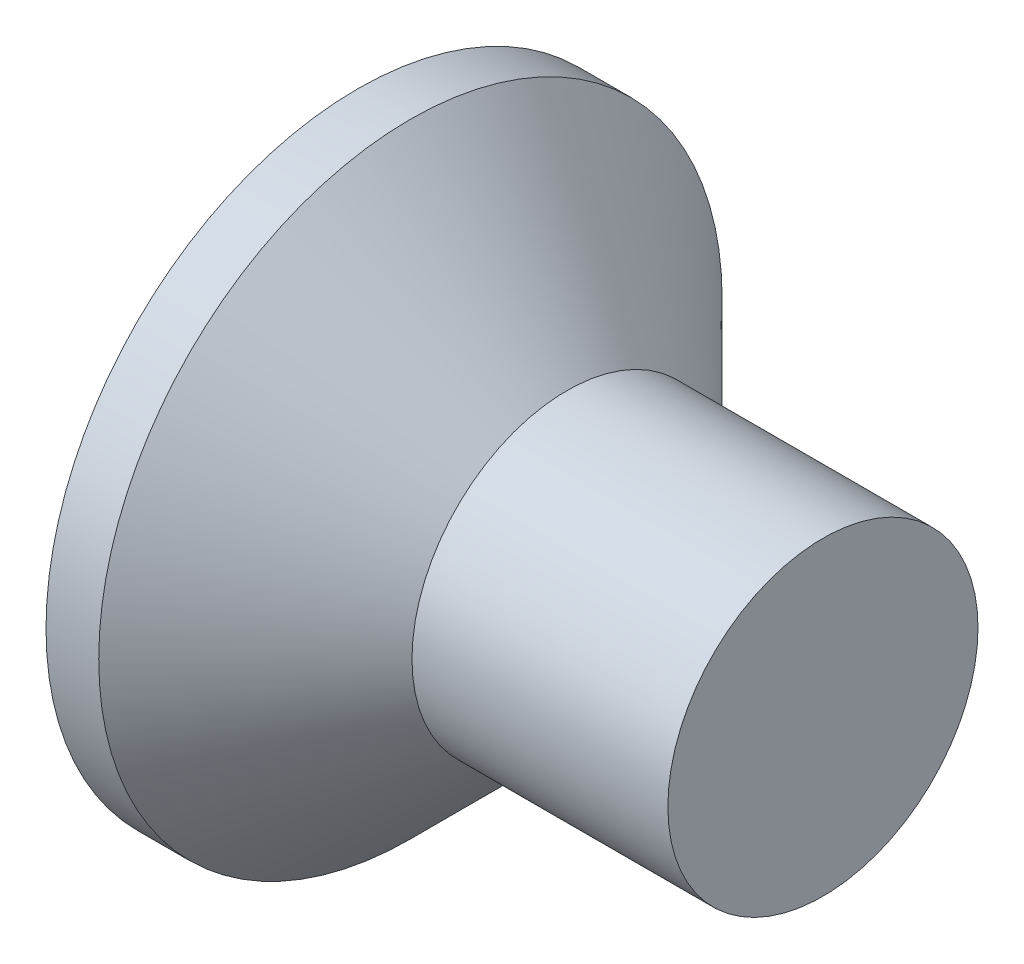
ISO-10303-21;
HEADER;
FILE_DESCRIPTION(('STEP AP214'),'2;1');
FILE_NAME('part.step','',(''),(''),'','','');
FILE_SCHEMA(('AUTOMOTIVE_DESIGN { 1 0 10303 214 1 1 1 1 }'));
ENDSEC;
DATA;
#1=APPLICATION_CONTEXT('core data for automotive mechanical design processes');
#2=APPLICATION_PROTOCOL_DEFINITION('international standard','automotive_design',2000,#1);
#3=PRODUCT_CONTEXT('',#1,'mechanical');
#4=PRODUCT('Part','Part','',(#3));
#5=PRODUCT_RELATED_PRODUCT_CATEGORY('part','',(#4));
#6=PRODUCT_DEFINITION_FORMATION('','',#4);
#7=PRODUCT_DEFINITION_CONTEXT('part definition',#1,'design');
#8=PRODUCT_DEFINITION('design','',#6,#7);
#9=PRODUCT_DEFINITION_SHAPE('','',#8);
#10=(LENGTH_UNIT() NAMED_UNIT(*) SI_UNIT(.MILLI.,.METRE.));
#11=(NAMED_UNIT(*) PLANE_ANGLE_UNIT() SI_UNIT($,.RADIAN.));
#12=(NAMED_UNIT(*) SI_UNIT($,.STERADIAN.) SOLID_ANGLE_UNIT());
#13=UNCERTAINTY_MEASURE_WITH_UNIT(LENGTH_MEASURE(1.E-05),#10,'distance_accuracy_value','');
#14=(GEOMETRIC_REPRESENTATION_CONTEXT(3) GLOBAL_UNCERTAINTY_ASSIGNED_CONTEXT((#13)) GLOBAL_UNIT_ASSIGNED_CONTEXT((#10,
#11,#12)) REPRESENTATION_CONTEXT('',''));
#15=CARTESIAN_POINT('',(0.,0.,0.));
#16=DIRECTION('',(0.,0.,1.));
#17=DIRECTION('',(1.,0.,0.));
#18=AXIS2_PLACEMENT_3D('',#15,#16,#17);
#19=CARTESIAN_POINT('',(0.,4.02,0.));
#20=DIRECTION('',(-1.,0.,0.));
#21=DIRECTION('',(0.,0.,1.));
#22=AXIS2_PLACEMENT_3D('',#19,#20,#21);
#23=PLANE('',#22);
#24=CARTESIAN_POINT('',(0.,0.,0.));
#25=DIRECTION('',(1.,0.,0.));
#26=DIRECTION('',(0.,0.,-1.));
#27=AXIS2_PLACEMENT_3D('',#24,#25,#26);
#28=CIRCLE('',#27,4.02);
#29=CARTESIAN_POINT('',(0.,0.,-4.02));
#30=VERTEX_POINT('',#29);
#31=EDGE_CURVE('E187',#30,#30,#28,.T.);
#32=ORIENTED_EDGE('',*,*,#31,.F.);
#33=EDGE_LOOP('',(#32));
#34=FACE_BOUND('',#33,.T.);
#35=DIRECTION('',(0.,1.,0.));
#36=VECTOR('',#35,1.);
#37=CARTESIAN_POINT('',(0.,-0.46,-0.46));
#38=LINE('',#37,#36);
#39=CARTESIAN_POINT('',(0.,-2.3,-0.46));
#40=VERTEX_POINT('',#39);
#41=CARTESIAN_POINT('',(0.,-0.76,-0.46));
#42=VERTEX_POINT('',#41);
#43=EDGE_CURVE('E313',#40,#42,#38,.T.);
#44=ORIENTED_EDGE('',*,*,#43,.T.);
#45=CARTESIAN_POINT('',(0.,-0.76,-0.76));
#46=DIRECTION('',(-1.,0.,0.));
#47=DIRECTION('',(0.,0.,1.));
#48=AXIS2_PLACEMENT_3D('',#45,#46,#47);
#49=CIRCLE('',#48,0.3);
#50=CARTESIAN_POINT('',(0.,-0.46,-0.76));
#51=VERTEX_POINT('',#50);
#52=EDGE_CURVE('E192',#42,#51,#49,.T.);
#53=ORIENTED_EDGE('',*,*,#52,.T.);
#54=DIRECTION('',(0.,0.,-1.));
#55=VECTOR('',#54,1.);
#56=CARTESIAN_POINT('',(0.,-0.46,-0.46));
#57=LINE('',#56,#55);
#58=CARTESIAN_POINT('',(0.,-0.46,-2.3));
#59=VERTEX_POINT('',#58);
#60=EDGE_CURVE('E315',#51,#59,#57,.T.);
#61=ORIENTED_EDGE('',*,*,#60,.T.);
#62=DIRECTION('',(0.,1.,0.));
#63=VECTOR('',#62,1.);
#64=CARTESIAN_POINT('',(0.,0.46,-2.3));
#65=LINE('',#64,#63);
#66=CARTESIAN_POINT('',(0.,0.46,-2.3));
#67=VERTEX_POINT('',#66);
#68=EDGE_CURVE('E317',#59,#67,#65,.T.);
#69=ORIENTED_EDGE('',*,*,#68,.T.);
#70=DIRECTION('',(0.,0.,1.));
#71=VECTOR('',#70,1.);
#72=CARTESIAN_POINT('',(0.,0.46,-0.46));
#73=LINE('',#72,#71);
#74=CARTESIAN_POINT('',(0.,0.46,-0.76));
#75=VERTEX_POINT('',#74);
#76=EDGE_CURVE('E320',#67,#75,#73,.T.);
#77=ORIENTED_EDGE('',*,*,#76,.T.);
#78=CARTESIAN_POINT('',(0.,0.76,-0.76));
#79=DIRECTION('',(-1.,0.,0.));
#80=DIRECTION('',(0.,0.,1.));
#81=AXIS2_PLACEMENT_3D('',#78,#79,#80);
#82=CIRCLE('',#81,0.3);
#83=CARTESIAN_POINT('',(0.,0.76,-0.46));
#84=VERTEX_POINT('',#83);
#85=EDGE_CURVE('E190',#75,#84,#82,.T.);
#86=ORIENTED_EDGE('',*,*,#85,.T.);
#87=DIRECTION('',(0.,1.,0.));
#88=VECTOR('',#87,1.);
#89=CARTESIAN_POINT('',(0.,0.46,-0.46));
#90=LINE('',#89,#88);
#91=CARTESIAN_POINT('',(0.,2.3,-0.46));
#92=VERTEX_POINT('',#91);
#93=EDGE_CURVE('E323',#84,#92,#90,.T.);
#94=ORIENTED_EDGE('',*,*,#93,.T.);
#95=DIRECTION('',(0.,0.,1.));
#96=VECTOR('',#95,1.);
#97=CARTESIAN_POINT('',(0.,2.3,-0.46));
#98=LINE('',#97,#96);
#99=CARTESIAN_POINT('',(0.,2.3,0.46));
#100=VERTEX_POINT('',#99);
#101=EDGE_CURVE('E325',#92,#100,#98,.T.);
#102=ORIENTED_EDGE('',*,*,#101,.T.);
#103=DIRECTION('',(0.,-1.,0.));
#104=VECTOR('',#103,1.);
#105=CARTESIAN_POINT('',(0.,0.46,0.46));
#106=LINE('',#105,#104);
#107=CARTESIAN_POINT('',(0.,0.76,0.46));
#108=VERTEX_POINT('',#107);
#109=EDGE_CURVE('E328',#100,#108,#106,.T.);
#110=ORIENTED_EDGE('',*,*,#109,.T.);
#111=CARTESIAN_POINT('',(0.,0.76,0.76));
#112=DIRECTION('',(-1.,0.,0.));
#113=DIRECTION('',(0.,0.,1.));
#114=AXIS2_PLACEMENT_3D('',#111,#112,#113);
#115=CIRCLE('',#114,0.3);
#116=CARTESIAN_POINT('',(0.,0.46,0.76));
#117=VERTEX_POINT('',#116);
#118=EDGE_CURVE('E155',#108,#117,#115,.T.);
#119=ORIENTED_EDGE('',*,*,#118,.T.);
#120=DIRECTION('',(0.,0.,1.));
#121=VECTOR('',#120,1.);
#122=CARTESIAN_POINT('',(0.,0.46,0.46));
#123=LINE('',#122,#121);
#124=CARTESIAN_POINT('',(0.,0.459999999999999,2.3));
#125=VERTEX_POINT('',#124);
#126=EDGE_CURVE('E149',#117,#125,#123,.T.);
#127=ORIENTED_EDGE('',*,*,#126,.T.);
#128=DIRECTION('',(0.,-1.,0.));
#129=VECTOR('',#128,1.);
#130=CARTESIAN_POINT('',(0.,0.459999999999999,2.3));
#131=LINE('',#130,#129);
#132=CARTESIAN_POINT('',(0.,-0.460000000000001,2.3));
#133=VERTEX_POINT('',#132);
#134=EDGE_CURVE('E153',#125,#133,#131,.T.);
#135=ORIENTED_EDGE('',*,*,#134,.T.);
#136=DIRECTION('',(0.,0.,-1.));
#137=VECTOR('',#136,1.);
#138=CARTESIAN_POINT('',(0.,-0.46,0.46));
#139=LINE('',#138,#137);
#140=CARTESIAN_POINT('',(0.,-0.46,0.76));
#141=VERTEX_POINT('',#140);
#142=EDGE_CURVE('E167',#133,#141,#139,.T.);
#143=ORIENTED_EDGE('',*,*,#142,.T.);
#144=CARTESIAN_POINT('',(0.,-0.76,0.76));
#145=DIRECTION('',(-1.,0.,0.));
#146=DIRECTION('',(0.,0.,1.));
#147=AXIS2_PLACEMENT_3D('',#144,#145,#146);
#148=CIRCLE('',#147,0.3);
#149=CARTESIAN_POINT('',(0.,-0.76,0.46));
#150=VERTEX_POINT('',#149);
#151=EDGE_CURVE('E186',#141,#150,#148,.T.);
#152=ORIENTED_EDGE('',*,*,#151,.T.);
#153=DIRECTION('',(0.,-1.,0.));
#154=VECTOR('',#153,1.);
#155=CARTESIAN_POINT('',(0.,-0.46,0.46));
#156=LINE('',#155,#154);
#157=CARTESIAN_POINT('',(0.,-2.3,0.459999999999999));
#158=VERTEX_POINT('',#157);
#159=EDGE_CURVE('E308',#150,#158,#156,.T.);
#160=ORIENTED_EDGE('',*,*,#159,.T.);
#161=DIRECTION('',(0.,0.,-1.));
#162=VECTOR('',#161,1.);
#163=CARTESIAN_POINT('',(0.,-2.3,-0.46));
#164=LINE('',#163,#162);
#165=EDGE_CURVE('E310',#158,#40,#164,.T.);
#166=ORIENTED_EDGE('',*,*,#165,.T.);
#167=EDGE_LOOP('',(#44,#53,#61,#69,#77,#86,#94,#102,#110,#119,#127,#135,#143,#152,#160,#166));
#168=FACE_BOUND('',#167,.T.);
#169=ADVANCED_FACE('F36',(#34,#168),#23,.T.);
#170=CARTESIAN_POINT('',(6.,2.,0.));
#171=DIRECTION('',(1.,0.,0.));
#172=DIRECTION('',(0.,0.,-1.));
#173=AXIS2_PLACEMENT_3D('',#170,#171,#172);
#174=PLANE('',#173);
#175=CARTESIAN_POINT('',(6.,0.,0.));
#176=DIRECTION('',(1.,0.,0.));
#177=DIRECTION('',(0.,0.,-1.));
#178=AXIS2_PLACEMENT_3D('',#175,#176,#177);
#179=CIRCLE('',#178,2.);
#180=CARTESIAN_POINT('',(6.,0.,-2.));
#181=VERTEX_POINT('',#180);
#182=EDGE_CURVE('E173',#181,#181,#179,.T.);
#183=ORIENTED_EDGE('',*,*,#182,.T.);
#184=EDGE_LOOP('',(#183));
#185=FACE_BOUND('',#184,.T.);
#186=ADVANCED_FACE('F240',(#185),#174,.T.);
#187=CARTESIAN_POINT('',(4.51581291088132,0.,0.));
#188=DIRECTION('',(1.,0.,0.));
#189=DIRECTION('',(0.,0.,-1.));
#190=AXIS2_PLACEMENT_3D('',#187,#188,#189);
#191=CYLINDRICAL_SURFACE('',#190,4.02);
#192=ORIENTED_EDGE('',*,*,#31,.T.);
#193=EDGE_LOOP('',(#192));
#194=FACE_BOUND('',#193,.T.);
#195=CARTESIAN_POINT('',(0.680000000000007,0.,0.));
#196=DIRECTION('',(1.,0.,0.));
#197=DIRECTION('',(0.,0.,-1.));
#198=AXIS2_PLACEMENT_3D('',#195,#196,#197);
#199=CIRCLE('',#198,4.02);
#200=CARTESIAN_POINT('',(0.680000000000007,0.,-4.02));
#201=VERTEX_POINT('',#200);
#202=EDGE_CURVE('E332',#201,#201,#199,.T.);
#203=ORIENTED_EDGE('',*,*,#202,.F.);
#204=EDGE_LOOP('',(#203));
#205=FACE_BOUND('',#204,.T.);
#206=ADVANCED_FACE('F246',(#194,#205),#191,.T.);
#207=CARTESIAN_POINT('',(2.7,0.,0.));
#208=DIRECTION('',(-1.,0.,0.));
#209=DIRECTION('',(0.,0.,1.));
#210=AXIS2_PLACEMENT_3D('',#207,#208,#209);
#211=CONICAL_SURFACE('',#210,2.,0.78539816339745);
#212=ORIENTED_EDGE('',*,*,#202,.T.);
#213=EDGE_LOOP('',(#212));
#214=FACE_BOUND('',#213,.T.);
#215=CARTESIAN_POINT('',(2.7,0.,0.));
#216=DIRECTION('',(1.,0.,0.));
#217=DIRECTION('',(0.,0.,-1.));
#218=AXIS2_PLACEMENT_3D('',#215,#216,#217);
#219=CIRCLE('',#218,2.);
#220=CARTESIAN_POINT('',(2.7,0.,-2.));
#221=VERTEX_POINT('',#220);
#222=EDGE_CURVE('E176',#221,#221,#219,.T.);
#223=ORIENTED_EDGE('',*,*,#222,.F.);
#224=EDGE_LOOP('',(#223));
#225=FACE_BOUND('',#224,.T.);
#226=ADVANCED_FACE('F368',(#214,#225),#211,.T.);
#227=CARTESIAN_POINT('',(4.51581291088132,0.,0.));
#228=DIRECTION('',(1.,0.,0.));
#229=DIRECTION('',(0.,0.,-1.));
#230=AXIS2_PLACEMENT_3D('',#227,#228,#229);
#231=CYLINDRICAL_SURFACE('',#230,2.);
#232=ORIENTED_EDGE('',*,*,#222,.T.);
#233=EDGE_LOOP('',(#232));
#234=FACE_BOUND('',#233,.T.);
#235=ORIENTED_EDGE('',*,*,#182,.F.);
#236=EDGE_LOOP('',(#235));
#237=FACE_BOUND('',#236,.T.);
#238=ADVANCED_FACE('F366',(#234,#237),#231,.T.);
#239=CARTESIAN_POINT('',(1.35,0.46,0.46));
#240=DIRECTION('',(0.,-1.,0.));
#241=DIRECTION('',(0.,0.,-1.));
#242=AXIS2_PLACEMENT_3D('',#239,#240,#241);
#243=PLANE('',#242);
#244=ORIENTED_EDGE('',*,*,#126,.F.);
#245=DIRECTION('',(-1.,0.,0.));
#246=VECTOR('',#245,1.);
#247=CARTESIAN_POINT('',(1.35,0.46,0.76));
#248=LINE('',#247,#246);
#249=CARTESIAN_POINT('',(1.35,0.46,0.76));
#250=VERTEX_POINT('',#249);
#251=EDGE_CURVE('E204',#117,#250,#248,.F.);
#252=ORIENTED_EDGE('',*,*,#251,.T.);
#253=DIRECTION('',(0.,0.,1.));
#254=VECTOR('',#253,1.);
#255=CARTESIAN_POINT('',(1.35,0.46,0.46));
#256=LINE('',#255,#254);
#257=CARTESIAN_POINT('',(1.35,0.46,1.520577136594));
#258=VERTEX_POINT('',#257);
#259=EDGE_CURVE('E171',#250,#258,#256,.T.);
#260=ORIENTED_EDGE('',*,*,#259,.T.);
#261=DIRECTION('',(-0.866025403784438,0.,0.500000000000001));
#262=VECTOR('',#261,1.);
#263=CARTESIAN_POINT('',(0.,0.459999999999999,2.3));
#264=LINE('',#263,#262);
#265=EDGE_CURVE('E163',#258,#125,#264,.T.);
#266=ORIENTED_EDGE('',*,*,#265,.T.);
#267=EDGE_LOOP('',(#244,#252,#260,#266));
#268=FACE_BOUND('',#267,.T.);
#269=ADVANCED_FACE('F169',(#268),#243,.T.);
#270=CARTESIAN_POINT('',(0.,0.459999999999999,2.3));
#271=DIRECTION('',(-0.500000000000001,0.,-0.866025403784438));
#272=DIRECTION('',(-0.866025403784438,0.,0.500000000000001));
#273=AXIS2_PLACEMENT_3D('',#270,#271,#272);
#274=PLANE('',#273);
#275=ORIENTED_EDGE('',*,*,#134,.F.);
#276=ORIENTED_EDGE('',*,*,#265,.F.);
#277=DIRECTION('',(0.,-1.,0.));
#278=VECTOR('',#277,1.);
#279=CARTESIAN_POINT('',(1.35,0.46,1.520577136594));
#280=LINE('',#279,#278);
#281=CARTESIAN_POINT('',(1.35,-0.46,1.520577136594));
#282=VERTEX_POINT('',#281);
#283=EDGE_CURVE('E182',#258,#282,#280,.T.);
#284=ORIENTED_EDGE('',*,*,#283,.T.);
#285=DIRECTION('',(-0.866025403784438,0.,0.500000000000001));
#286=VECTOR('',#285,1.);
#287=CARTESIAN_POINT('',(1.80924337148168,-0.46,1.2554328524455));
#288=LINE('',#287,#286);
#289=EDGE_CURVE('E165',#282,#133,#288,.T.);
#290=ORIENTED_EDGE('',*,*,#289,.T.);
#291=EDGE_LOOP('',(#275,#276,#284,#290));
#292=FACE_BOUND('',#291,.T.);
#293=ADVANCED_FACE('F162',(#292),#274,.T.);
#294=CARTESIAN_POINT('',(1.35,-0.46,0.46));
#295=DIRECTION('',(0.,1.,0.));
#296=DIRECTION('',(0.,0.,1.));
#297=AXIS2_PLACEMENT_3D('',#294,#295,#296);
#298=PLANE('',#297);
#299=DIRECTION('',(0.,0.,-1.));
#300=VECTOR('',#299,1.);
#301=CARTESIAN_POINT('',(1.35,-0.46,0.46));
#302=LINE('',#301,#300);
#303=CARTESIAN_POINT('',(1.35,-0.46,0.76));
#304=VERTEX_POINT('',#303);
#305=EDGE_CURVE('E354',#282,#304,#302,.T.);
#306=ORIENTED_EDGE('',*,*,#305,.T.);
#307=DIRECTION('',(-1.,0.,0.));
#308=VECTOR('',#307,1.);
#309=CARTESIAN_POINT('',(1.35,-0.46,0.76));
#310=LINE('',#309,#308);
#311=EDGE_CURVE('E206',#304,#141,#310,.T.);
#312=ORIENTED_EDGE('',*,*,#311,.T.);
#313=ORIENTED_EDGE('',*,*,#142,.F.);
#314=ORIENTED_EDGE('',*,*,#289,.F.);
#315=EDGE_LOOP('',(#306,#312,#313,#314));
#316=FACE_BOUND('',#315,.T.);
#317=ADVANCED_FACE('F260',(#316),#298,.T.);
#318=CARTESIAN_POINT('',(1.35,-0.46,0.46));
#319=DIRECTION('',(0.,0.,-1.));
#320=DIRECTION('',(0.,1.,0.));
#321=AXIS2_PLACEMENT_3D('',#318,#319,#320);
#322=PLANE('',#321);
#323=ORIENTED_EDGE('',*,*,#159,.F.);
#324=DIRECTION('',(-1.,0.,0.));
#325=VECTOR('',#324,1.);
#326=CARTESIAN_POINT('',(1.35,-0.76,0.46));
#327=LINE('',#326,#325);
#328=CARTESIAN_POINT('',(1.35,-0.76,0.46));
#329=VERTEX_POINT('',#328);
#330=EDGE_CURVE('E51',#150,#329,#327,.F.);
#331=ORIENTED_EDGE('',*,*,#330,.T.);
#332=DIRECTION('',(0.,-1.,0.));
#333=VECTOR('',#332,1.);
#334=CARTESIAN_POINT('',(1.35,-0.46,0.46));
#335=LINE('',#334,#333);
#336=CARTESIAN_POINT('',(1.35,-1.520577136594,0.459999999999999));
#337=VERTEX_POINT('',#336);
#338=EDGE_CURVE('E297',#329,#337,#335,.T.);
#339=ORIENTED_EDGE('',*,*,#338,.T.);
#340=DIRECTION('',(-0.866025403784438,-0.500000000000001,0.));
#341=VECTOR('',#340,1.);
#342=CARTESIAN_POINT('',(0.,-2.3,0.459999999999999));
#343=LINE('',#342,#341);
#344=EDGE_CURVE('E178',#337,#158,#343,.T.);
#345=ORIENTED_EDGE('',*,*,#344,.T.);
#346=EDGE_LOOP('',(#323,#331,#339,#345));
#347=FACE_BOUND('',#346,.T.);
#348=ADVANCED_FACE('F265',(#347),#322,.T.);
#349=CARTESIAN_POINT('',(0.,-2.3,-0.46));
#350=DIRECTION('',(-0.500000000000001,0.866025403784438,0.));
#351=DIRECTION('',(-0.866025403784438,-0.500000000000001,0.));
#352=AXIS2_PLACEMENT_3D('',#349,#350,#351);
#353=PLANE('',#352);
#354=ORIENTED_EDGE('',*,*,#165,.F.);
#355=ORIENTED_EDGE('',*,*,#344,.F.);
#356=DIRECTION('',(0.,0.,-1.));
#357=VECTOR('',#356,1.);
#358=CARTESIAN_POINT('',(1.35,-1.520577136594,-0.46));
#359=LINE('',#358,#357);
#360=CARTESIAN_POINT('',(1.35,-1.520577136594,-0.46));
#361=VERTEX_POINT('',#360);
#362=EDGE_CURVE('E293',#337,#361,#359,.T.);
#363=ORIENTED_EDGE('',*,*,#362,.T.);
#364=DIRECTION('',(-0.866025403784438,-0.500000000000001,0.));
#365=VECTOR('',#364,1.);
#366=CARTESIAN_POINT('',(1.80924337148168,-1.2554328524455,-0.46));
#367=LINE('',#366,#365);
#368=EDGE_CURVE('E292',#361,#40,#367,.T.);
#369=ORIENTED_EDGE('',*,*,#368,.T.);
#370=EDGE_LOOP('',(#354,#355,#363,#369));
#371=FACE_BOUND('',#370,.T.);
#372=ADVANCED_FACE('F261',(#371),#353,.T.);
#373=CARTESIAN_POINT('',(1.35,-0.46,-0.46));
#374=DIRECTION('',(0.,0.,1.));
#375=DIRECTION('',(0.,-1.,0.));
#376=AXIS2_PLACEMENT_3D('',#373,#374,#375);
#377=PLANE('',#376);
#378=DIRECTION('',(0.,1.,0.));
#379=VECTOR('',#378,1.);
#380=CARTESIAN_POINT('',(1.35,-0.46,-0.46));
#381=LINE('',#380,#379);
#382=CARTESIAN_POINT('',(1.35,-0.76,-0.46));
#383=VERTEX_POINT('',#382);
#384=EDGE_CURVE('E286',#361,#383,#381,.T.);
#385=ORIENTED_EDGE('',*,*,#384,.T.);
#386=DIRECTION('',(-1.,0.,0.));
#387=VECTOR('',#386,1.);
#388=CARTESIAN_POINT('',(1.35,-0.76,-0.46));
#389=LINE('',#388,#387);
#390=EDGE_CURVE('E183',#383,#42,#389,.T.);
#391=ORIENTED_EDGE('',*,*,#390,.T.);
#392=ORIENTED_EDGE('',*,*,#43,.F.);
#393=ORIENTED_EDGE('',*,*,#368,.F.);
#394=EDGE_LOOP('',(#385,#391,#392,#393));
#395=FACE_BOUND('',#394,.T.);
#396=ADVANCED_FACE('F264',(#395),#377,.T.);
#397=CARTESIAN_POINT('',(1.35,-0.46,-0.46));
#398=DIRECTION('',(0.,1.,0.));
#399=DIRECTION('',(0.,0.,1.));
#400=AXIS2_PLACEMENT_3D('',#397,#398,#399);
#401=PLANE('',#400);
#402=ORIENTED_EDGE('',*,*,#60,.F.);
#403=DIRECTION('',(-1.,0.,0.));
#404=VECTOR('',#403,1.);
#405=CARTESIAN_POINT('',(1.35,-0.46,-0.76));
#406=LINE('',#405,#404);
#407=CARTESIAN_POINT('',(1.35,-0.46,-0.76));
#408=VERTEX_POINT('',#407);
#409=EDGE_CURVE('E194',#51,#408,#406,.F.);
#410=ORIENTED_EDGE('',*,*,#409,.T.);
#411=DIRECTION('',(0.,0.,-1.));
#412=VECTOR('',#411,1.);
#413=CARTESIAN_POINT('',(1.35,-0.46,-0.46));
#414=LINE('',#413,#412);
#415=CARTESIAN_POINT('',(1.35,-0.46,-1.520577136594));
#416=VERTEX_POINT('',#415);
#417=EDGE_CURVE('E288',#408,#416,#414,.T.);
#418=ORIENTED_EDGE('',*,*,#417,.T.);
#419=DIRECTION('',(-0.866025403784438,0.,-0.500000000000001));
#420=VECTOR('',#419,1.);
#421=CARTESIAN_POINT('',(0.,-0.46,-2.3));
#422=LINE('',#421,#420);
#423=EDGE_CURVE('E344',#416,#59,#422,.T.);
#424=ORIENTED_EDGE('',*,*,#423,.T.);
#425=EDGE_LOOP('',(#402,#410,#418,#424));
#426=FACE_BOUND('',#425,.T.);
#427=ADVANCED_FACE('F271',(#426),#401,.T.);
#428=CARTESIAN_POINT('',(0.,0.46,-2.3));
#429=DIRECTION('',(-0.500000000000001,0.,0.866025403784438));
#430=DIRECTION('',(0.866025403784438,0.,0.500000000000001));
#431=AXIS2_PLACEMENT_3D('',#428,#429,#430);
#432=PLANE('',#431);
#433=ORIENTED_EDGE('',*,*,#68,.F.);
#434=ORIENTED_EDGE('',*,*,#423,.F.);
#435=DIRECTION('',(0.,1.,0.));
#436=VECTOR('',#435,1.);
#437=CARTESIAN_POINT('',(1.35,0.46,-1.520577136594));
#438=LINE('',#437,#436);
#439=CARTESIAN_POINT('',(1.35,0.46,-1.520577136594));
#440=VERTEX_POINT('',#439);
#441=EDGE_CURVE('E295',#416,#440,#438,.T.);
#442=ORIENTED_EDGE('',*,*,#441,.T.);
#443=DIRECTION('',(-0.866025403784438,0.,-0.500000000000001));
#444=VECTOR('',#443,1.);
#445=CARTESIAN_POINT('',(1.80924337148168,0.46,-1.2554328524455));
#446=LINE('',#445,#444);
#447=EDGE_CURVE('E342',#440,#67,#446,.T.);
#448=ORIENTED_EDGE('',*,*,#447,.T.);
#449=EDGE_LOOP('',(#433,#434,#442,#448));
#450=FACE_BOUND('',#449,.T.);
#451=ADVANCED_FACE('F267',(#450),#432,.T.);
#452=CARTESIAN_POINT('',(1.35,0.46,-0.46));
#453=DIRECTION('',(0.,-1.,0.));
#454=DIRECTION('',(0.,0.,-1.));
#455=AXIS2_PLACEMENT_3D('',#452,#453,#454);
#456=PLANE('',#455);
#457=DIRECTION('',(0.,0.,1.));
#458=VECTOR('',#457,1.);
#459=CARTESIAN_POINT('',(1.35,0.46,-0.46));
#460=LINE('',#459,#458);
#461=CARTESIAN_POINT('',(1.35,0.46,-0.76));
#462=VERTEX_POINT('',#461);
#463=EDGE_CURVE('E302',#440,#462,#460,.T.);
#464=ORIENTED_EDGE('',*,*,#463,.T.);
#465=DIRECTION('',(-1.,0.,0.));
#466=VECTOR('',#465,1.);
#467=CARTESIAN_POINT('',(1.35,0.46,-0.76));
#468=LINE('',#467,#466);
#469=EDGE_CURVE('E196',#462,#75,#468,.T.);
#470=ORIENTED_EDGE('',*,*,#469,.T.);
#471=ORIENTED_EDGE('',*,*,#76,.F.);
#472=ORIENTED_EDGE('',*,*,#447,.F.);
#473=EDGE_LOOP('',(#464,#470,#471,#472));
#474=FACE_BOUND('',#473,.T.);
#475=ADVANCED_FACE('F270',(#474),#456,.T.);
#476=CARTESIAN_POINT('',(1.35,0.46,-0.46));
#477=DIRECTION('',(0.,0.,1.));
#478=DIRECTION('',(0.,-1.,0.));
#479=AXIS2_PLACEMENT_3D('',#476,#477,#478);
#480=PLANE('',#479);
#481=ORIENTED_EDGE('',*,*,#93,.F.);
#482=DIRECTION('',(-1.,0.,0.));
#483=VECTOR('',#482,1.);
#484=CARTESIAN_POINT('',(1.35,0.76,-0.46));
#485=LINE('',#484,#483);
#486=CARTESIAN_POINT('',(1.35,0.76,-0.46));
#487=VERTEX_POINT('',#486);
#488=EDGE_CURVE('E199',#84,#487,#485,.F.);
#489=ORIENTED_EDGE('',*,*,#488,.T.);
#490=DIRECTION('',(0.,1.,0.));
#491=VECTOR('',#490,1.);
#492=CARTESIAN_POINT('',(1.35,0.46,-0.46));
#493=LINE('',#492,#491);
#494=CARTESIAN_POINT('',(1.35,1.520577136594,-0.46));
#495=VERTEX_POINT('',#494);
#496=EDGE_CURVE('E305',#487,#495,#493,.T.);
#497=ORIENTED_EDGE('',*,*,#496,.T.);
#498=DIRECTION('',(-0.866025403784438,0.500000000000001,0.));
#499=VECTOR('',#498,1.);
#500=CARTESIAN_POINT('',(0.,2.3,-0.46));
#501=LINE('',#500,#499);
#502=EDGE_CURVE('E338',#495,#92,#501,.T.);
#503=ORIENTED_EDGE('',*,*,#502,.T.);
#504=EDGE_LOOP('',(#481,#489,#497,#503));
#505=FACE_BOUND('',#504,.T.);
#506=ADVANCED_FACE('F256',(#505),#480,.T.);
#507=CARTESIAN_POINT('',(0.,2.3,-0.46));
#508=DIRECTION('',(-0.500000000000001,-0.866025403784438,0.));
#509=DIRECTION('',(0.866025403784438,-0.500000000000001,0.));
#510=AXIS2_PLACEMENT_3D('',#507,#508,#509);
#511=PLANE('',#510);
#512=ORIENTED_EDGE('',*,*,#101,.F.);
#513=ORIENTED_EDGE('',*,*,#502,.F.);
#514=DIRECTION('',(0.,0.,1.));
#515=VECTOR('',#514,1.);
#516=CARTESIAN_POINT('',(1.35,1.520577136594,-0.46));
#517=LINE('',#516,#515);
#518=CARTESIAN_POINT('',(1.35,1.520577136594,0.46));
#519=VERTEX_POINT('',#518);
#520=EDGE_CURVE('E226',#495,#519,#517,.T.);
#521=ORIENTED_EDGE('',*,*,#520,.T.);
#522=DIRECTION('',(-0.866025403784438,0.500000000000001,0.));
#523=VECTOR('',#522,1.);
#524=CARTESIAN_POINT('',(1.80924337148168,1.2554328524455,0.46));
#525=LINE('',#524,#523);
#526=EDGE_CURVE('E225',#519,#100,#525,.T.);
#527=ORIENTED_EDGE('',*,*,#526,.T.);
#528=EDGE_LOOP('',(#512,#513,#521,#527));
#529=FACE_BOUND('',#528,.T.);
#530=ADVANCED_FACE('F253',(#529),#511,.T.);
#531=CARTESIAN_POINT('',(1.35,0.46,0.46));
#532=DIRECTION('',(0.,0.,-1.));
#533=DIRECTION('',(0.,1.,0.));
#534=AXIS2_PLACEMENT_3D('',#531,#532,#533);
#535=PLANE('',#534);
#536=DIRECTION('',(0.,-1.,0.));
#537=VECTOR('',#536,1.);
#538=CARTESIAN_POINT('',(1.35,0.46,0.46));
#539=LINE('',#538,#537);
#540=CARTESIAN_POINT('',(1.35,0.76,0.46));
#541=VERTEX_POINT('',#540);
#542=EDGE_CURVE('E218',#519,#541,#539,.T.);
#543=ORIENTED_EDGE('',*,*,#542,.T.);
#544=DIRECTION('',(-1.,0.,0.));
#545=VECTOR('',#544,1.);
#546=CARTESIAN_POINT('',(1.35,0.76,0.46));
#547=LINE('',#546,#545);
#548=EDGE_CURVE('E201',#541,#108,#547,.T.);
#549=ORIENTED_EDGE('',*,*,#548,.T.);
#550=ORIENTED_EDGE('',*,*,#109,.F.);
#551=ORIENTED_EDGE('',*,*,#526,.F.);
#552=EDGE_LOOP('',(#543,#549,#550,#551));
#553=FACE_BOUND('',#552,.T.);
#554=ADVANCED_FACE('F223',(#553),#535,.T.);
#555=CARTESIAN_POINT('',(1.35,0.46,0.46));
#556=DIRECTION('',(1.,0.,0.));
#557=DIRECTION('',(0.,0.,-1.));
#558=AXIS2_PLACEMENT_3D('',#555,#556,#557);
#559=PLANE('',#558);
#560=ORIENTED_EDGE('',*,*,#259,.F.);
#561=CARTESIAN_POINT('',(1.35,0.76,0.76));
#562=DIRECTION('',(1.,0.,0.));
#563=DIRECTION('',(0.,0.,-1.));
#564=AXIS2_PLACEMENT_3D('',#561,#562,#563);
#565=CIRCLE('',#564,0.3);
#566=EDGE_CURVE('E44',#250,#541,#565,.T.);
#567=ORIENTED_EDGE('',*,*,#566,.T.);
#568=ORIENTED_EDGE('',*,*,#542,.F.);
#569=ORIENTED_EDGE('',*,*,#520,.F.);
#570=ORIENTED_EDGE('',*,*,#496,.F.);
#571=CARTESIAN_POINT('',(1.35,0.76,-0.76));
#572=DIRECTION('',(1.,0.,0.));
#573=DIRECTION('',(0.,0.,-1.));
#574=AXIS2_PLACEMENT_3D('',#571,#572,#573);
#575=CIRCLE('',#574,0.3);
#576=EDGE_CURVE('E212',#487,#462,#575,.T.);
#577=ORIENTED_EDGE('',*,*,#576,.T.);
#578=ORIENTED_EDGE('',*,*,#463,.F.);
#579=ORIENTED_EDGE('',*,*,#441,.F.);
#580=ORIENTED_EDGE('',*,*,#417,.F.);
#581=CARTESIAN_POINT('',(1.35,-0.76,-0.76));
#582=DIRECTION('',(1.,0.,0.));
#583=DIRECTION('',(0.,0.,-1.));
#584=AXIS2_PLACEMENT_3D('',#581,#582,#583);
#585=CIRCLE('',#584,0.3);
#586=EDGE_CURVE('E210',#408,#383,#585,.T.);
#587=ORIENTED_EDGE('',*,*,#586,.T.);
#588=ORIENTED_EDGE('',*,*,#384,.F.);
#589=ORIENTED_EDGE('',*,*,#362,.F.);
#590=ORIENTED_EDGE('',*,*,#338,.F.);
#591=CARTESIAN_POINT('',(1.35,-0.76,0.76));
#592=DIRECTION('',(1.,0.,0.));
#593=DIRECTION('',(0.,0.,-1.));
#594=AXIS2_PLACEMENT_3D('',#591,#592,#593);
#595=CIRCLE('',#594,0.3);
#596=EDGE_CURVE('E11',#329,#304,#595,.T.);
#597=ORIENTED_EDGE('',*,*,#596,.T.);
#598=ORIENTED_EDGE('',*,*,#305,.F.);
#599=ORIENTED_EDGE('',*,*,#283,.F.);
#600=EDGE_LOOP('',(#560,#567,#568,#569,#570,#577,#578,#579,#580,#587,#588,#589,#590,#597,#598,#599));
#601=FACE_BOUND('',#600,.T.);
#602=ADVANCED_FACE('F216',(#601),#559,.F.);
#603=CARTESIAN_POINT('',(1.35,-0.76,-0.76));
#604=DIRECTION('',(-1.,0.,0.));
#605=DIRECTION('',(0.,0.,1.));
#606=AXIS2_PLACEMENT_3D('',#603,#604,#605);
#607=CYLINDRICAL_SURFACE('',#606,0.3);
#608=ORIENTED_EDGE('',*,*,#586,.F.);
#609=ORIENTED_EDGE('',*,*,#409,.F.);
#610=ORIENTED_EDGE('',*,*,#52,.F.);
#611=ORIENTED_EDGE('',*,*,#390,.F.);
#612=EDGE_LOOP('',(#608,#609,#610,#611));
#613=FACE_BOUND('',#612,.T.);
#614=ADVANCED_FACE('F236',(#613),#607,.T.);
#615=CARTESIAN_POINT('',(1.35,0.76,-0.76));
#616=DIRECTION('',(-1.,0.,0.));
#617=DIRECTION('',(0.,0.,1.));
#618=AXIS2_PLACEMENT_3D('',#615,#616,#617);
#619=CYLINDRICAL_SURFACE('',#618,0.3);
#620=ORIENTED_EDGE('',*,*,#576,.F.);
#621=ORIENTED_EDGE('',*,*,#488,.F.);
#622=ORIENTED_EDGE('',*,*,#85,.F.);
#623=ORIENTED_EDGE('',*,*,#469,.F.);
#624=EDGE_LOOP('',(#620,#621,#622,#623));
#625=FACE_BOUND('',#624,.T.);
#626=ADVANCED_FACE('F230',(#625),#619,.T.);
#627=CARTESIAN_POINT('',(1.35,0.76,0.76));
#628=DIRECTION('',(-1.,0.,0.));
#629=DIRECTION('',(0.,0.,1.));
#630=AXIS2_PLACEMENT_3D('',#627,#628,#629);
#631=CYLINDRICAL_SURFACE('',#630,0.3);
#632=ORIENTED_EDGE('',*,*,#566,.F.);
#633=ORIENTED_EDGE('',*,*,#251,.F.);
#634=ORIENTED_EDGE('',*,*,#118,.F.);
#635=ORIENTED_EDGE('',*,*,#548,.F.);
#636=EDGE_LOOP('',(#632,#633,#634,#635));
#637=FACE_BOUND('',#636,.T.);
#638=ADVANCED_FACE('F228',(#637),#631,.T.);
#639=CARTESIAN_POINT('',(1.35,-0.76,0.76));
#640=DIRECTION('',(-1.,0.,0.));
#641=DIRECTION('',(0.,0.,1.));
#642=AXIS2_PLACEMENT_3D('',#639,#640,#641);
#643=CYLINDRICAL_SURFACE('',#642,0.3);
#644=ORIENTED_EDGE('',*,*,#596,.F.);
#645=ORIENTED_EDGE('',*,*,#330,.F.);
#646=ORIENTED_EDGE('',*,*,#151,.F.);
#647=ORIENTED_EDGE('',*,*,#311,.F.);
#648=EDGE_LOOP('',(#644,#645,#646,#647));
#649=FACE_BOUND('',#648,.T.);
#650=ADVANCED_FACE('F38',(#649),#643,.T.);
#651=CLOSED_SHELL('',(#169,#186,#206,#226,#238,#269,#293,#317,#348,#372,#396,#427,#451,#475,
#506,#530,#554,#602,#614,#626,#638,#650));
#652=MANIFOLD_SOLID_BREP('B2',#651);
#653=ADVANCED_BREP_SHAPE_REPRESENTATION('',(#18,#652),#14);
#654=SHAPE_DEFINITION_REPRESENTATION(#9,#653);
ENDSEC;
END-ISO-10303-21;
